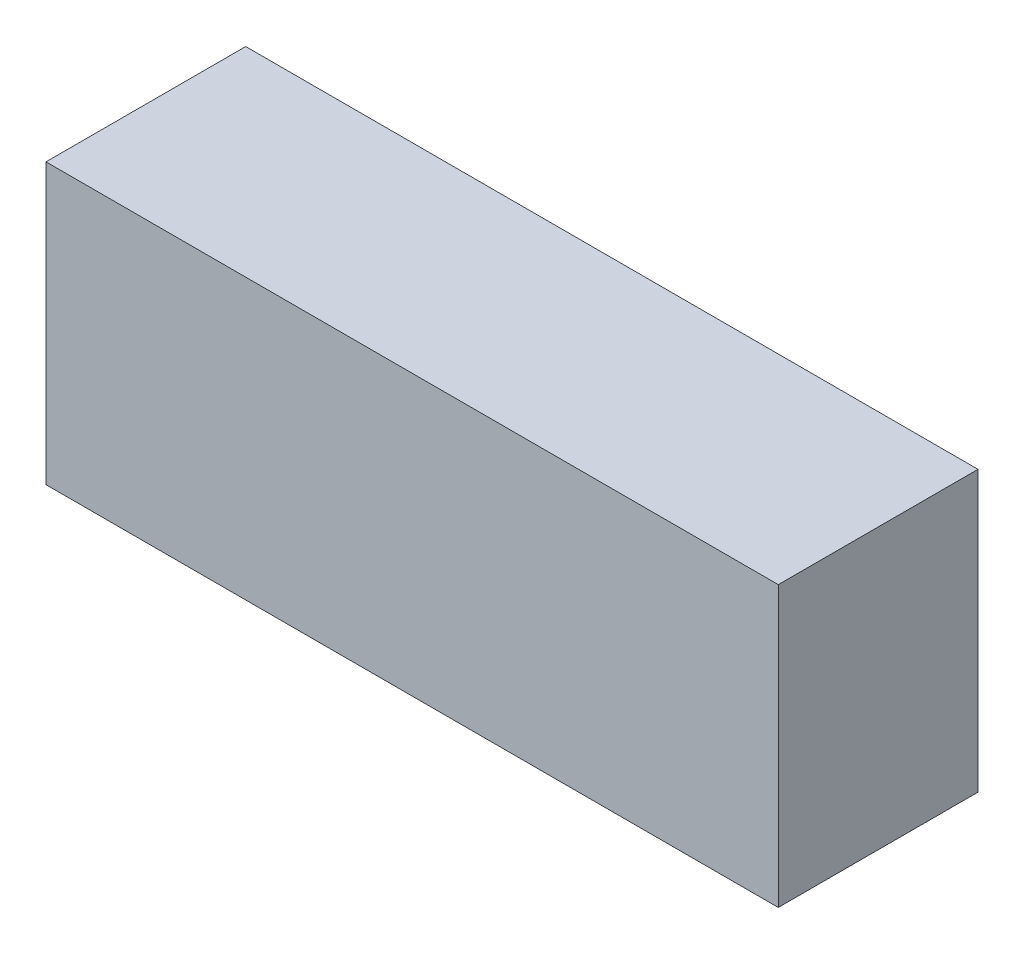
ISO-10303-21;
HEADER;
FILE_DESCRIPTION(('STEP AP214'),'2;1');
FILE_NAME('part.step','',(''),(''),'','','');
FILE_SCHEMA(('AUTOMOTIVE_DESIGN { 1 0 10303 214 1 1 1 1 }'));
ENDSEC;
DATA;
#1=APPLICATION_CONTEXT('core data for automotive mechanical design processes');
#2=APPLICATION_PROTOCOL_DEFINITION('international standard','automotive_design',2000,#1);
#3=PRODUCT_CONTEXT('',#1,'mechanical');
#4=PRODUCT('Part','Part','',(#3));
#5=PRODUCT_RELATED_PRODUCT_CATEGORY('part','',(#4));
#6=PRODUCT_DEFINITION_FORMATION('','',#4);
#7=PRODUCT_DEFINITION_CONTEXT('part definition',#1,'design');
#8=PRODUCT_DEFINITION('design','',#6,#7);
#9=PRODUCT_DEFINITION_SHAPE('','',#8);
#10=(LENGTH_UNIT() NAMED_UNIT(*) SI_UNIT(.MILLI.,.METRE.));
#11=(NAMED_UNIT(*) PLANE_ANGLE_UNIT() SI_UNIT($,.RADIAN.));
#12=(NAMED_UNIT(*) SI_UNIT($,.STERADIAN.) SOLID_ANGLE_UNIT());
#13=UNCERTAINTY_MEASURE_WITH_UNIT(LENGTH_MEASURE(1.E-05),#10,'distance_accuracy_value','');
#14=(GEOMETRIC_REPRESENTATION_CONTEXT(3) GLOBAL_UNCERTAINTY_ASSIGNED_CONTEXT((#13)) GLOBAL_UNIT_ASSIGNED_CONTEXT((#10,
#11,#12)) REPRESENTATION_CONTEXT('',''));
#15=CARTESIAN_POINT('',(0.,0.,0.));
#16=DIRECTION('',(0.,0.,1.));
#17=DIRECTION('',(1.,0.,0.));
#18=AXIS2_PLACEMENT_3D('',#15,#16,#17);
#19=CARTESIAN_POINT('',(-27.5,-10.5,15.));
#20=DIRECTION('',(0.,0.,1.));
#21=DIRECTION('',(1.,0.,0.));
#22=AXIS2_PLACEMENT_3D('',#19,#20,#21);
#23=PLANE('',#22);
#24=DIRECTION('',(0.,1.,0.));
#25=VECTOR('',#24,1.);
#26=CARTESIAN_POINT('',(-27.5,-10.5,15.));
#27=LINE('',#26,#25);
#28=CARTESIAN_POINT('',(-27.5,-10.5,15.));
#29=VERTEX_POINT('',#28);
#30=CARTESIAN_POINT('',(-27.5,10.5,15.));
#31=VERTEX_POINT('',#30);
#32=EDGE_CURVE('E90',#29,#31,#27,.T.);
#33=ORIENTED_EDGE('',*,*,#32,.F.);
#34=DIRECTION('',(1.,0.,0.));
#35=VECTOR('',#34,1.);
#36=CARTESIAN_POINT('',(-27.5,-10.5,15.));
#37=LINE('',#36,#35);
#38=CARTESIAN_POINT('',(27.5,-10.5,15.));
#39=VERTEX_POINT('',#38);
#40=EDGE_CURVE('E73',#29,#39,#37,.T.);
#41=ORIENTED_EDGE('',*,*,#40,.T.);
#42=DIRECTION('',(0.,1.,0.));
#43=VECTOR('',#42,1.);
#44=CARTESIAN_POINT('',(27.5,-10.5,15.));
#45=LINE('',#44,#43);
#46=CARTESIAN_POINT('',(27.5,10.5,15.));
#47=VERTEX_POINT('',#46);
#48=EDGE_CURVE('E84',#39,#47,#45,.T.);
#49=ORIENTED_EDGE('',*,*,#48,.T.);
#50=DIRECTION('',(1.,0.,0.));
#51=VECTOR('',#50,1.);
#52=CARTESIAN_POINT('',(-27.5,10.5,15.));
#53=LINE('',#52,#51);
#54=EDGE_CURVE('E10',#31,#47,#53,.T.);
#55=ORIENTED_EDGE('',*,*,#54,.F.);
#56=EDGE_LOOP('',(#33,#41,#49,#55));
#57=FACE_BOUND('',#56,.T.);
#58=ADVANCED_FACE('F16',(#57),#23,.T.);
#59=CARTESIAN_POINT('',(-27.5,-10.5,0.));
#60=DIRECTION('',(0.,0.,1.));
#61=DIRECTION('',(1.,0.,0.));
#62=AXIS2_PLACEMENT_3D('',#59,#60,#61);
#63=PLANE('',#62);
#64=DIRECTION('',(1.,0.,0.));
#65=VECTOR('',#64,1.);
#66=CARTESIAN_POINT('',(-27.5,10.5,0.));
#67=LINE('',#66,#65);
#68=CARTESIAN_POINT('',(-27.5,10.5,0.));
#69=VERTEX_POINT('',#68);
#70=CARTESIAN_POINT('',(27.5,10.5,0.));
#71=VERTEX_POINT('',#70);
#72=EDGE_CURVE('E24',#69,#71,#67,.T.);
#73=ORIENTED_EDGE('',*,*,#72,.T.);
#74=DIRECTION('',(0.,1.,0.));
#75=VECTOR('',#74,1.);
#76=CARTESIAN_POINT('',(27.5,-10.5,0.));
#77=LINE('',#76,#75);
#78=CARTESIAN_POINT('',(27.5,-10.5,0.));
#79=VERTEX_POINT('',#78);
#80=EDGE_CURVE('E105',#79,#71,#77,.T.);
#81=ORIENTED_EDGE('',*,*,#80,.F.);
#82=DIRECTION('',(1.,0.,0.));
#83=VECTOR('',#82,1.);
#84=CARTESIAN_POINT('',(-27.5,-10.5,0.));
#85=LINE('',#84,#83);
#86=CARTESIAN_POINT('',(-27.5,-10.5,0.));
#87=VERTEX_POINT('',#86);
#88=EDGE_CURVE('E59',#87,#79,#85,.T.);
#89=ORIENTED_EDGE('',*,*,#88,.F.);
#90=DIRECTION('',(0.,1.,0.));
#91=VECTOR('',#90,1.);
#92=CARTESIAN_POINT('',(-27.5,-10.5,0.));
#93=LINE('',#92,#91);
#94=EDGE_CURVE('E91',#87,#69,#93,.T.);
#95=ORIENTED_EDGE('',*,*,#94,.T.);
#96=EDGE_LOOP('',(#73,#81,#89,#95));
#97=FACE_BOUND('',#96,.T.);
#98=ADVANCED_FACE('F128',(#97),#63,.F.);
#99=CARTESIAN_POINT('',(-27.5,10.5,0.));
#100=DIRECTION('',(0.,1.,0.));
#101=DIRECTION('',(1.,0.,0.));
#102=AXIS2_PLACEMENT_3D('',#99,#100,#101);
#103=PLANE('',#102);
#104=ORIENTED_EDGE('',*,*,#72,.F.);
#105=DIRECTION('',(0.,0.,1.));
#106=VECTOR('',#105,1.);
#107=CARTESIAN_POINT('',(-27.5,10.5,0.));
#108=LINE('',#107,#106);
#109=EDGE_CURVE('E95',#69,#31,#108,.T.);
#110=ORIENTED_EDGE('',*,*,#109,.T.);
#111=ORIENTED_EDGE('',*,*,#54,.T.);
#112=DIRECTION('',(0.,0.,1.));
#113=VECTOR('',#112,1.);
#114=CARTESIAN_POINT('',(27.5,10.5,0.));
#115=LINE('',#114,#113);
#116=EDGE_CURVE('E108',#71,#47,#115,.T.);
#117=ORIENTED_EDGE('',*,*,#116,.F.);
#118=EDGE_LOOP('',(#104,#110,#111,#117));
#119=FACE_BOUND('',#118,.T.);
#120=ADVANCED_FACE('F123',(#119),#103,.T.);
#121=CARTESIAN_POINT('',(-27.5,-10.5,0.));
#122=DIRECTION('',(0.,1.,0.));
#123=DIRECTION('',(1.,0.,0.));
#124=AXIS2_PLACEMENT_3D('',#121,#122,#123);
#125=PLANE('',#124);
#126=DIRECTION('',(0.,0.,1.));
#127=VECTOR('',#126,1.);
#128=CARTESIAN_POINT('',(27.5,-10.5,0.));
#129=LINE('',#128,#127);
#130=EDGE_CURVE('E79',#79,#39,#129,.T.);
#131=ORIENTED_EDGE('',*,*,#130,.T.);
#132=ORIENTED_EDGE('',*,*,#40,.F.);
#133=DIRECTION('',(0.,0.,1.));
#134=VECTOR('',#133,1.);
#135=CARTESIAN_POINT('',(-27.5,-10.5,0.));
#136=LINE('',#135,#134);
#137=EDGE_CURVE('E76',#87,#29,#136,.T.);
#138=ORIENTED_EDGE('',*,*,#137,.F.);
#139=ORIENTED_EDGE('',*,*,#88,.T.);
#140=EDGE_LOOP('',(#131,#132,#138,#139));
#141=FACE_BOUND('',#140,.T.);
#142=ADVANCED_FACE('F75',(#141),#125,.F.);
#143=CARTESIAN_POINT('',(27.5,-10.5,0.));
#144=DIRECTION('',(1.,0.,0.));
#145=DIRECTION('',(0.,1.,0.));
#146=AXIS2_PLACEMENT_3D('',#143,#144,#145);
#147=PLANE('',#146);
#148=ORIENTED_EDGE('',*,*,#130,.F.);
#149=ORIENTED_EDGE('',*,*,#80,.T.);
#150=ORIENTED_EDGE('',*,*,#116,.T.);
#151=ORIENTED_EDGE('',*,*,#48,.F.);
#152=EDGE_LOOP('',(#148,#149,#150,#151));
#153=FACE_BOUND('',#152,.T.);
#154=ADVANCED_FACE('F136',(#153),#147,.T.);
#155=CARTESIAN_POINT('',(-27.5,-10.5,0.));
#156=DIRECTION('',(1.,0.,0.));
#157=DIRECTION('',(0.,1.,0.));
#158=AXIS2_PLACEMENT_3D('',#155,#156,#157);
#159=PLANE('',#158);
#160=ORIENTED_EDGE('',*,*,#32,.T.);
#161=ORIENTED_EDGE('',*,*,#109,.F.);
#162=ORIENTED_EDGE('',*,*,#94,.F.);
#163=ORIENTED_EDGE('',*,*,#137,.T.);
#164=EDGE_LOOP('',(#160,#161,#162,#163));
#165=FACE_BOUND('',#164,.T.);
#166=ADVANCED_FACE('F88',(#165),#159,.F.);
#167=CLOSED_SHELL('',(#58,#98,#120,#142,#154,#166));
#168=MANIFOLD_SOLID_BREP('B1',#167);
#169=ADVANCED_BREP_SHAPE_REPRESENTATION('',(#18,#168),#14);
#170=SHAPE_DEFINITION_REPRESENTATION(#9,#169);
ENDSEC;
END-ISO-10303-21;
